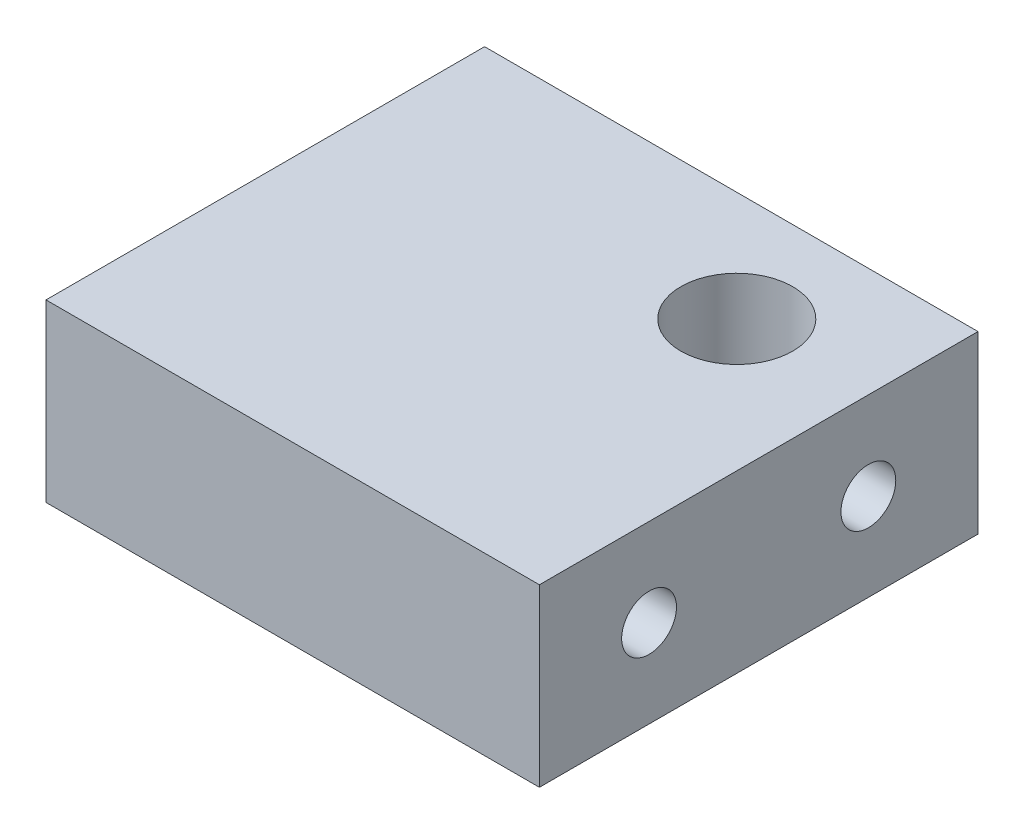
ISO-10303-21;
HEADER;
FILE_DESCRIPTION(('STEP AP214'),'2;1');
FILE_NAME('part.step','',(''),(''),'','','');
FILE_SCHEMA(('AUTOMOTIVE_DESIGN { 1 0 10303 214 1 1 1 1 }'));
ENDSEC;
DATA;
#1=APPLICATION_CONTEXT('core data for automotive mechanical design processes');
#2=APPLICATION_PROTOCOL_DEFINITION('international standard','automotive_design',2000,#1);
#3=PRODUCT_CONTEXT('',#1,'mechanical');
#4=PRODUCT('Part','Part','',(#3));
#5=PRODUCT_RELATED_PRODUCT_CATEGORY('part','',(#4));
#6=PRODUCT_DEFINITION_FORMATION('','',#4);
#7=PRODUCT_DEFINITION_CONTEXT('part definition',#1,'design');
#8=PRODUCT_DEFINITION('design','',#6,#7);
#9=PRODUCT_DEFINITION_SHAPE('','',#8);
#10=(LENGTH_UNIT() NAMED_UNIT(*) SI_UNIT(.MILLI.,.METRE.));
#11=(NAMED_UNIT(*) PLANE_ANGLE_UNIT() SI_UNIT($,.RADIAN.));
#12=(NAMED_UNIT(*) SI_UNIT($,.STERADIAN.) SOLID_ANGLE_UNIT());
#13=UNCERTAINTY_MEASURE_WITH_UNIT(LENGTH_MEASURE(1.E-05),#10,'distance_accuracy_value','');
#14=(GEOMETRIC_REPRESENTATION_CONTEXT(3) GLOBAL_UNCERTAINTY_ASSIGNED_CONTEXT((#13)) GLOBAL_UNIT_ASSIGNED_CONTEXT((#10,
#11,#12)) REPRESENTATION_CONTEXT('',''));
#15=CARTESIAN_POINT('',(0.,0.,0.));
#16=DIRECTION('',(0.,0.,1.));
#17=DIRECTION('',(1.,0.,0.));
#18=AXIS2_PLACEMENT_3D('',#15,#16,#17);
#19=CARTESIAN_POINT('',(22.5,16.,-20.));
#20=DIRECTION('',(-1.,0.,0.));
#21=DIRECTION('',(0.,0.,1.));
#22=AXIS2_PLACEMENT_3D('',#19,#20,#21);
#23=PLANE('',#22);
#24=CARTESIAN_POINT('',(22.5,8.,-10.));
#25=DIRECTION('',(1.,0.,0.));
#26=DIRECTION('',(0.,0.,-1.));
#27=AXIS2_PLACEMENT_3D('',#24,#25,#26);
#28=CIRCLE('',#27,2.49999999999999);
#29=CARTESIAN_POINT('',(22.5,8.,-12.5));
#30=VERTEX_POINT('',#29);
#31=EDGE_CURVE('E132',#30,#30,#28,.T.);
#32=ORIENTED_EDGE('',*,*,#31,.F.);
#33=EDGE_LOOP('',(#32));
#34=FACE_BOUND('',#33,.T.);
#35=CARTESIAN_POINT('',(22.5,8.,10.));
#36=DIRECTION('',(1.,0.,0.));
#37=DIRECTION('',(0.,0.,-1.));
#38=AXIS2_PLACEMENT_3D('',#35,#36,#37);
#39=CIRCLE('',#38,2.5);
#40=CARTESIAN_POINT('',(22.5,8.,7.5));
#41=VERTEX_POINT('',#40);
#42=EDGE_CURVE('E121',#41,#41,#39,.T.);
#43=ORIENTED_EDGE('',*,*,#42,.F.);
#44=EDGE_LOOP('',(#43));
#45=FACE_BOUND('',#44,.T.);
#46=DIRECTION('',(0.,0.,-1.));
#47=VECTOR('',#46,1.);
#48=CARTESIAN_POINT('',(22.5,0.,-20.));
#49=LINE('',#48,#47);
#50=CARTESIAN_POINT('',(22.5,0.,20.));
#51=VERTEX_POINT('',#50);
#52=CARTESIAN_POINT('',(22.5,0.,-20.));
#53=VERTEX_POINT('',#52);
#54=EDGE_CURVE('E111',#51,#53,#49,.T.);
#55=ORIENTED_EDGE('',*,*,#54,.T.);
#56=DIRECTION('',(0.,-1.,0.));
#57=VECTOR('',#56,1.);
#58=CARTESIAN_POINT('',(22.5,16.,-20.));
#59=LINE('',#58,#57);
#60=CARTESIAN_POINT('',(22.5,16.,-20.));
#61=VERTEX_POINT('',#60);
#62=EDGE_CURVE('E11',#61,#53,#59,.T.);
#63=ORIENTED_EDGE('',*,*,#62,.F.);
#64=DIRECTION('',(0.,0.,-1.));
#65=VECTOR('',#64,1.);
#66=CARTESIAN_POINT('',(22.5,16.,-20.));
#67=LINE('',#66,#65);
#68=CARTESIAN_POINT('',(22.5,16.,20.));
#69=VERTEX_POINT('',#68);
#70=EDGE_CURVE('E98',#69,#61,#67,.T.);
#71=ORIENTED_EDGE('',*,*,#70,.F.);
#72=DIRECTION('',(0.,-1.,0.));
#73=VECTOR('',#72,1.);
#74=CARTESIAN_POINT('',(22.5,16.,20.));
#75=LINE('',#74,#73);
#76=EDGE_CURVE('E107',#69,#51,#75,.T.);
#77=ORIENTED_EDGE('',*,*,#76,.T.);
#78=EDGE_LOOP('',(#55,#63,#71,#77));
#79=FACE_BOUND('',#78,.T.);
#80=ADVANCED_FACE('F40',(#34,#45,#79),#23,.F.);
#81=CARTESIAN_POINT('',(-22.5,16.,-20.));
#82=DIRECTION('',(0.,0.,1.));
#83=DIRECTION('',(1.,0.,0.));
#84=AXIS2_PLACEMENT_3D('',#81,#82,#83);
#85=PLANE('',#84);
#86=DIRECTION('',(-1.,0.,0.));
#87=VECTOR('',#86,1.);
#88=CARTESIAN_POINT('',(-22.5,0.,-20.));
#89=LINE('',#88,#87);
#90=CARTESIAN_POINT('',(-22.5,0.,-20.));
#91=VERTEX_POINT('',#90);
#92=EDGE_CURVE('E102',#53,#91,#89,.T.);
#93=ORIENTED_EDGE('',*,*,#92,.T.);
#94=DIRECTION('',(0.,-1.,0.));
#95=VECTOR('',#94,1.);
#96=CARTESIAN_POINT('',(-22.5,16.,-20.));
#97=LINE('',#96,#95);
#98=CARTESIAN_POINT('',(-22.5,16.,-20.));
#99=VERTEX_POINT('',#98);
#100=EDGE_CURVE('E54',#99,#91,#97,.T.);
#101=ORIENTED_EDGE('',*,*,#100,.F.);
#102=DIRECTION('',(-1.,0.,0.));
#103=VECTOR('',#102,1.);
#104=CARTESIAN_POINT('',(-22.5,16.,-20.));
#105=LINE('',#104,#103);
#106=EDGE_CURVE('E93',#61,#99,#105,.T.);
#107=ORIENTED_EDGE('',*,*,#106,.F.);
#108=ORIENTED_EDGE('',*,*,#62,.T.);
#109=EDGE_LOOP('',(#93,#101,#107,#108));
#110=FACE_BOUND('',#109,.T.);
#111=ADVANCED_FACE('F101',(#110),#85,.F.);
#112=CARTESIAN_POINT('',(-22.5,16.,-20.));
#113=DIRECTION('',(1.,0.,0.));
#114=DIRECTION('',(0.,0.,-1.));
#115=AXIS2_PLACEMENT_3D('',#112,#113,#114);
#116=PLANE('',#115);
#117=CARTESIAN_POINT('',(-22.5,8.,10.));
#118=DIRECTION('',(1.,0.,0.));
#119=DIRECTION('',(0.,0.,-1.));
#120=AXIS2_PLACEMENT_3D('',#117,#118,#119);
#121=CIRCLE('',#120,2.49999999999999);
#122=CARTESIAN_POINT('',(-22.5,8.,7.50000000000001));
#123=VERTEX_POINT('',#122);
#124=EDGE_CURVE('E114',#123,#123,#121,.T.);
#125=ORIENTED_EDGE('',*,*,#124,.T.);
#126=EDGE_LOOP('',(#125));
#127=FACE_BOUND('',#126,.T.);
#128=DIRECTION('',(0.,0.,1.));
#129=VECTOR('',#128,1.);
#130=CARTESIAN_POINT('',(-22.5,0.,-20.));
#131=LINE('',#130,#129);
#132=CARTESIAN_POINT('',(-22.5,0.,20.));
#133=VERTEX_POINT('',#132);
#134=EDGE_CURVE('E80',#91,#133,#131,.T.);
#135=ORIENTED_EDGE('',*,*,#134,.T.);
#136=DIRECTION('',(0.,-1.,0.));
#137=VECTOR('',#136,1.);
#138=CARTESIAN_POINT('',(-22.5,16.,20.));
#139=LINE('',#138,#137);
#140=CARTESIAN_POINT('',(-22.5,16.,20.));
#141=VERTEX_POINT('',#140);
#142=EDGE_CURVE('E103',#141,#133,#139,.T.);
#143=ORIENTED_EDGE('',*,*,#142,.F.);
#144=DIRECTION('',(0.,0.,1.));
#145=VECTOR('',#144,1.);
#146=CARTESIAN_POINT('',(-22.5,16.,-20.));
#147=LINE('',#146,#145);
#148=EDGE_CURVE('E96',#99,#141,#147,.T.);
#149=ORIENTED_EDGE('',*,*,#148,.F.);
#150=ORIENTED_EDGE('',*,*,#100,.T.);
#151=EDGE_LOOP('',(#135,#143,#149,#150));
#152=FACE_BOUND('',#151,.T.);
#153=ADVANCED_FACE('F105',(#127,#152),#116,.F.);
#154=CARTESIAN_POINT('',(-22.5,16.,20.));
#155=DIRECTION('',(0.,0.,-1.));
#156=DIRECTION('',(-1.,0.,0.));
#157=AXIS2_PLACEMENT_3D('',#154,#155,#156);
#158=PLANE('',#157);
#159=DIRECTION('',(1.,0.,0.));
#160=VECTOR('',#159,1.);
#161=CARTESIAN_POINT('',(-22.5,0.,20.));
#162=LINE('',#161,#160);
#163=EDGE_CURVE('E86',#133,#51,#162,.T.);
#164=ORIENTED_EDGE('',*,*,#163,.T.);
#165=ORIENTED_EDGE('',*,*,#76,.F.);
#166=DIRECTION('',(1.,0.,0.));
#167=VECTOR('',#166,1.);
#168=CARTESIAN_POINT('',(-22.5,16.,20.));
#169=LINE('',#168,#167);
#170=EDGE_CURVE('E63',#141,#69,#169,.T.);
#171=ORIENTED_EDGE('',*,*,#170,.F.);
#172=ORIENTED_EDGE('',*,*,#142,.T.);
#173=EDGE_LOOP('',(#164,#165,#171,#172));
#174=FACE_BOUND('',#173,.T.);
#175=ADVANCED_FACE('F157',(#174),#158,.F.);
#176=CARTESIAN_POINT('',(0.,16.,0.));
#177=DIRECTION('',(0.,1.,0.));
#178=DIRECTION('',(0.,0.,1.));
#179=AXIS2_PLACEMENT_3D('',#176,#177,#178);
#180=PLANE('',#179);
#181=CARTESIAN_POINT('',(10.5,16.,-10.));
#182=DIRECTION('',(0.,1.,0.));
#183=DIRECTION('',(0.,0.,1.));
#184=AXIS2_PLACEMENT_3D('',#181,#182,#183);
#185=CIRCLE('',#184,5.1);
#186=CARTESIAN_POINT('',(10.5,16.,-4.9));
#187=VERTEX_POINT('',#186);
#188=EDGE_CURVE('E122',#187,#187,#185,.T.);
#189=ORIENTED_EDGE('',*,*,#188,.F.);
#190=EDGE_LOOP('',(#189));
#191=FACE_BOUND('',#190,.T.);
#192=ORIENTED_EDGE('',*,*,#70,.T.);
#193=ORIENTED_EDGE('',*,*,#106,.T.);
#194=ORIENTED_EDGE('',*,*,#148,.T.);
#195=ORIENTED_EDGE('',*,*,#170,.T.);
#196=EDGE_LOOP('',(#192,#193,#194,#195));
#197=FACE_BOUND('',#196,.T.);
#198=ADVANCED_FACE('F94',(#191,#197),#180,.T.);
#199=CARTESIAN_POINT('',(0.,0.,0.));
#200=DIRECTION('',(0.,1.,0.));
#201=DIRECTION('',(0.,0.,1.));
#202=AXIS2_PLACEMENT_3D('',#199,#200,#201);
#203=PLANE('',#202);
#204=CARTESIAN_POINT('',(10.5,0.,-10.));
#205=DIRECTION('',(0.,1.,0.));
#206=DIRECTION('',(0.,0.,1.));
#207=AXIS2_PLACEMENT_3D('',#204,#205,#206);
#208=CIRCLE('',#207,5.1);
#209=CARTESIAN_POINT('',(10.5,0.,-4.9));
#210=VERTEX_POINT('',#209);
#211=EDGE_CURVE('E119',#210,#210,#208,.T.);
#212=ORIENTED_EDGE('',*,*,#211,.T.);
#213=EDGE_LOOP('',(#212));
#214=FACE_BOUND('',#213,.T.);
#215=ORIENTED_EDGE('',*,*,#54,.F.);
#216=ORIENTED_EDGE('',*,*,#163,.F.);
#217=ORIENTED_EDGE('',*,*,#134,.F.);
#218=ORIENTED_EDGE('',*,*,#92,.F.);
#219=EDGE_LOOP('',(#215,#216,#217,#218));
#220=FACE_BOUND('',#219,.T.);
#221=ADVANCED_FACE('F143',(#214,#220),#203,.F.);
#222=CARTESIAN_POINT('',(22.5,8.,10.));
#223=DIRECTION('',(1.,0.,0.));
#224=DIRECTION('',(0.,0.,-1.));
#225=AXIS2_PLACEMENT_3D('',#222,#223,#224);
#226=CYLINDRICAL_SURFACE('',#225,2.49999999999999);
#227=ORIENTED_EDGE('',*,*,#124,.F.);
#228=EDGE_LOOP('',(#227));
#229=FACE_BOUND('',#228,.T.);
#230=ORIENTED_EDGE('',*,*,#42,.T.);
#231=EDGE_LOOP('',(#230));
#232=FACE_BOUND('',#231,.T.);
#233=ADVANCED_FACE('F139',(#229,#232),#226,.F.);
#234=CARTESIAN_POINT('',(10.5,-34.,-10.));
#235=DIRECTION('',(0.,1.,0.));
#236=DIRECTION('',(0.,0.,1.));
#237=AXIS2_PLACEMENT_3D('',#234,#235,#236);
#238=CYLINDRICAL_SURFACE('',#237,5.1);
#239=CARTESIAN_POINT('',(14.9452221541786,8.,-12.5));
#240=CARTESIAN_POINT('',(14.9452341781503,8.13065942306062,-12.4999899268338));
#241=CARTESIAN_POINT('',(14.9510704186964,8.2614977066524,-12.4896882121571));
#242=CARTESIAN_POINT('',(14.9735846953,8.51918747609081,-12.448988831659));
#243=CARTESIAN_POINT('',(14.9902864003836,8.64602962294407,-12.4185472913408));
#244=CARTESIAN_POINT('',(15.0321334699429,8.89152053295177,-12.3391769482568));
#245=CARTESIAN_POINT('',(15.0572352412892,9.01020786011905,-12.2903434319279));
#246=CARTESIAN_POINT('',(15.11298728877,9.23767586731527,-12.1758651109733));
#247=CARTESIAN_POINT('',(15.1436376763648,9.34645634827005,-12.1102199686256));
#248=CARTESIAN_POINT('',(15.2099996026152,9.560533814051,-11.9578886440971));
#249=CARTESIAN_POINT('',(15.2459197062037,9.66487448565695,-11.8699487676741));
#250=CARTESIAN_POINT('',(15.3170873855396,9.85806528710076,-11.6781345693015));
#251=CARTESIAN_POINT('',(15.352334629474,9.94690794148148,-11.5742526028572));
#252=CARTESIAN_POINT('',(15.4208923130437,10.1121544560318,-11.3453513847376));
#253=CARTESIAN_POINT('',(15.4539333130559,10.1873942311476,-11.2194035003452));
#254=CARTESIAN_POINT('',(15.5116678260202,10.3151834802366,-10.9547156308523));
#255=CARTESIAN_POINT('',(15.5363664047029,10.3677467293697,-10.8159834740722));
#256=CARTESIAN_POINT('',(15.5731333915223,10.4449440286125,-10.5397865109852));
#257=CARTESIAN_POINT('',(15.5859541840783,10.4712515602317,-10.4028918439405));
#258=CARTESIAN_POINT('',(15.6003205261151,10.5006889519668,-10.126076562647));
#259=CARTESIAN_POINT('',(15.601872596402,10.5038322164304,-9.98615774539211));
#260=CARTESIAN_POINT('',(15.5938943880732,10.4875270758056,-9.71979466192461));
#261=CARTESIAN_POINT('',(15.5852804234713,10.469946746447,-9.59320243133429));
#262=CARTESIAN_POINT('',(15.5593072161055,10.4160187032759,-9.34503411816819));
#263=CARTESIAN_POINT('',(15.5419473208534,10.3796695892173,-9.22345841058127));
#264=CARTESIAN_POINT('',(15.4997732666074,10.2889653861162,-8.98661115154658));
#265=CARTESIAN_POINT('',(15.4748565540191,10.2343614454667,-8.87145391899077));
#266=CARTESIAN_POINT('',(15.419838694866,10.1090236474363,-8.65165166538445));
#267=CARTESIAN_POINT('',(15.3897356722335,10.0382839501837,-8.54701047011151));
#268=CARTESIAN_POINT('',(15.3239358038252,9.87521278139449,-8.34096828512831));
#269=CARTESIAN_POINT('',(15.2879791321643,9.78149553945774,-8.24074602430407));
#270=CARTESIAN_POINT('',(15.2163342537504,9.57885755411288,-8.05681868128261));
#271=CARTESIAN_POINT('',(15.1806462571963,9.46992599449922,-7.97312545304249));
#272=CARTESIAN_POINT('',(15.1113127725438,9.23202572814185,-7.81979458759039));
#273=CARTESIAN_POINT('',(15.0779135173967,9.10225231176734,-7.75128328451126));
#274=CARTESIAN_POINT('',(15.0202966050179,8.83099045906496,-7.6375810108092));
#275=CARTESIAN_POINT('',(14.9960696896172,8.68951401202936,-7.59236650865518));
#276=CARTESIAN_POINT('',(14.9621641629086,8.41052435614513,-7.53012883335292));
#277=CARTESIAN_POINT('',(14.9514965285077,8.27356553930103,-7.51117857901439));
#278=CARTESIAN_POINT('',(14.9430956430177,7.99804072371846,-7.49620386343317));
#279=CARTESIAN_POINT('',(14.9453540389517,7.85947582062554,-7.50016459681542));
#280=CARTESIAN_POINT('',(14.9615033367101,7.59988572600996,-7.52913082577092));
#281=CARTESIAN_POINT('',(14.9741705827787,7.47852538991782,-7.5519238935854));
#282=CARTESIAN_POINT('',(15.0079321581849,7.24156459468083,-7.61466836889667));
#283=CARTESIAN_POINT('',(15.0290290885209,7.12596592570515,-7.65462507255823));
#284=CARTESIAN_POINT('',(15.078428596422,6.89772098008298,-7.75253058228358));
#285=CARTESIAN_POINT('',(15.1070202616818,6.78546100797726,-7.81122864995615));
#286=CARTESIAN_POINT('',(15.1679117637679,6.57174424103298,-7.94428835202927));
#287=CARTESIAN_POINT('',(15.200213488423,6.47029299717491,-8.01865797696227));
#288=CARTESIAN_POINT('',(15.2695547727576,6.2683225509564,-8.19140839365784));
#289=CARTESIAN_POINT('',(15.3066971320141,6.16938108121667,-8.29160081530674));
#290=CARTESIAN_POINT('',(15.3781436635503,5.98924660786944,-8.50779630873176));
#291=CARTESIAN_POINT('',(15.4124469910909,5.90805887507767,-8.62380405928981));
#292=CARTESIAN_POINT('',(15.4753757558678,5.76423491461949,-8.87200576650252));
#293=CARTESIAN_POINT('',(15.5038553019906,5.70205957219819,-9.00450635501803));
#294=CARTESIAN_POINT('',(15.550829054598,5.60148671521929,-9.27988220893866));
#295=CARTESIAN_POINT('',(15.569331688241,5.56306912925177,-9.42274860259368));
#296=CARTESIAN_POINT('',(15.5929693351772,5.5142925745151,-9.7010066108365));
#297=CARTESIAN_POINT('',(15.5991517315913,5.50173179637201,-9.83592427605626));
#298=CARTESIAN_POINT('',(15.6006832592796,5.49860483126433,-10.1060569878208));
#299=CARTESIAN_POINT('',(15.5960358895073,5.50803154043577,-10.2412719242194));
#300=CARTESIAN_POINT('',(15.5770405424408,5.54712396880107,-10.4993895324765));
#301=CARTESIAN_POINT('',(15.5633091761207,5.57550423916087,-10.6225369558441));
#302=CARTESIAN_POINT('',(15.5280599330324,5.65000830186129,-10.8621412943586));
#303=CARTESIAN_POINT('',(15.5065408970822,5.69613473575421,-10.9785972104935));
#304=CARTESIAN_POINT('',(15.4565017559493,5.80695264053086,-11.2072223132413));
#305=CARTESIAN_POINT('',(15.4277164074056,5.87236842716916,-11.3189806685429));
#306=CARTESIAN_POINT('',(15.366209642033,6.0189836858805,-11.5304074340112));
#307=CARTESIAN_POINT('',(15.333486415451,6.10019042573187,-11.6300702427733));
#308=CARTESIAN_POINT('',(15.2636832141087,6.28515536126319,-11.8245533873839));
#309=CARTESIAN_POINT('',(15.2264866473472,6.39033037895119,-11.9179893758271));
#310=CARTESIAN_POINT('',(15.1546232701581,6.61547134591626,-12.0863553571629));
#311=CARTESIAN_POINT('',(15.1199585686524,6.73544940669764,-12.1612700438171));
#312=CARTESIAN_POINT('',(15.0565410513427,6.99119418165393,-12.2920276395213));
#313=CARTESIAN_POINT('',(15.0279638429156,7.12728838900891,-12.3473286110937));
#314=CARTESIAN_POINT('',(14.9936965467047,7.33807615707204,-12.4119014467625));
#315=CARTESIAN_POINT('',(14.9837123998695,7.40937843780662,-12.4303541425625));
#316=CARTESIAN_POINT('',(14.9669994090287,7.553682842825,-12.4609399716032));
#317=CARTESIAN_POINT('',(14.9602682580087,7.62668372384162,-12.4730775839503));
#318=CARTESIAN_POINT('',(14.9519793511766,7.74984245968419,-12.4879560736167));
#319=CARTESIAN_POINT('',(14.9494517440312,7.79972962432496,-12.4924678646617));
#320=CARTESIAN_POINT('',(14.94607078526,7.89973573476312,-12.4984918556974));
#321=CARTESIAN_POINT('',(14.9452175395422,7.94985469502124,-12.5000038659438));
#322=CARTESIAN_POINT('',(14.9452221541786,8.,-12.5));
#323=B_SPLINE_CURVE_WITH_KNOTS('',3,(#239,#240,#241,#242,#243,#244,#245,#246,#247,#248,#249,
#250,#251,#252,#253,#254,#255,#256,#257,#258,#259,#260,#261,#262,#263,#264,#265,#266,#267,#268,
#269,#270,#271,#272,#273,#274,#275,#276,#277,#278,#279,#280,#281,#282,#283,#284,#285,#286,#287,
#288,#289,#290,#291,#292,#293,#294,#295,#296,#297,#298,#299,#300,#301,#302,#303,#304,#305,#306,
#307,#308,#309,#310,#311,#312,#313,#314,#315,#316,#317,#318,#319,#320,#321,#322),.UNSPECIFIED.,
.T.,.F.,(4,2,2,2,2,2,2,2,2,2,2,2,2,2,2,2,2,2,2,2,2,2,2,2,2,2,2,2,2,2,2,2,2,2,2,2,2,2,2,2,2,4),
(0.,0.391776072034615,0.784408448843954,1.17503402236765,1.56566744362698,1.98720279774157,
2.40894092026233,2.85774290385953,3.30627187146971,3.72392562601776,4.14133768001622,
4.52382797563397,4.90634681108159,5.29430859701141,5.68241101793671,6.10613158681109,
6.53015493629328,6.97929689444522,7.42798429148447,7.84160522009237,8.25495889140646,
8.62568423283852,8.99652405086026,9.3845826044095,9.77283950007686,10.2077637951689,
10.6428170379224,11.0877054946941,11.5322175783227,11.9369815509164,12.3416147677829,
12.7212666980614,13.100975162175,13.4973059150002,13.8938195124573,14.3284145781919,
14.7633676071954,15.2095427922834,15.4322245581984,15.6547481663058,15.8050969710679,
15.9554552854961),.UNSPECIFIED.);
#324=CARTESIAN_POINT('',(14.9452221541786,8.,-12.5));
#325=VERTEX_POINT('',#324);
#326=EDGE_CURVE('E43',#325,#325,#323,.T.);
#327=ORIENTED_EDGE('',*,*,#326,.T.);
#328=EDGE_LOOP('',(#327));
#329=FACE_BOUND('',#328,.T.);
#330=ORIENTED_EDGE('',*,*,#188,.T.);
#331=EDGE_LOOP('',(#330));
#332=FACE_BOUND('',#331,.T.);
#333=ORIENTED_EDGE('',*,*,#211,.F.);
#334=EDGE_LOOP('',(#333));
#335=FACE_BOUND('',#334,.T.);
#336=ADVANCED_FACE('F142',(#329,#332,#335),#238,.F.);
#337=CARTESIAN_POINT('',(22.5,8.,-10.));
#338=DIRECTION('',(1.,0.,0.));
#339=DIRECTION('',(0.,0.,-1.));
#340=AXIS2_PLACEMENT_3D('',#337,#338,#339);
#341=CYLINDRICAL_SURFACE('',#340,2.49999999999999);
#342=ORIENTED_EDGE('',*,*,#31,.T.);
#343=EDGE_LOOP('',(#342));
#344=FACE_BOUND('',#343,.T.);
#345=ORIENTED_EDGE('',*,*,#326,.F.);
#346=EDGE_LOOP('',(#345));
#347=FACE_BOUND('',#346,.T.);
#348=ADVANCED_FACE('F207',(#344,#347),#341,.F.);
#349=CLOSED_SHELL('',(#80,#111,#153,#175,#198,#221,#233,#336,#348));
#350=MANIFOLD_SOLID_BREP('B2',#349);
#351=ADVANCED_BREP_SHAPE_REPRESENTATION('',(#18,#350),#14);
#352=SHAPE_DEFINITION_REPRESENTATION(#9,#351);
ENDSEC;
END-ISO-10303-21;
